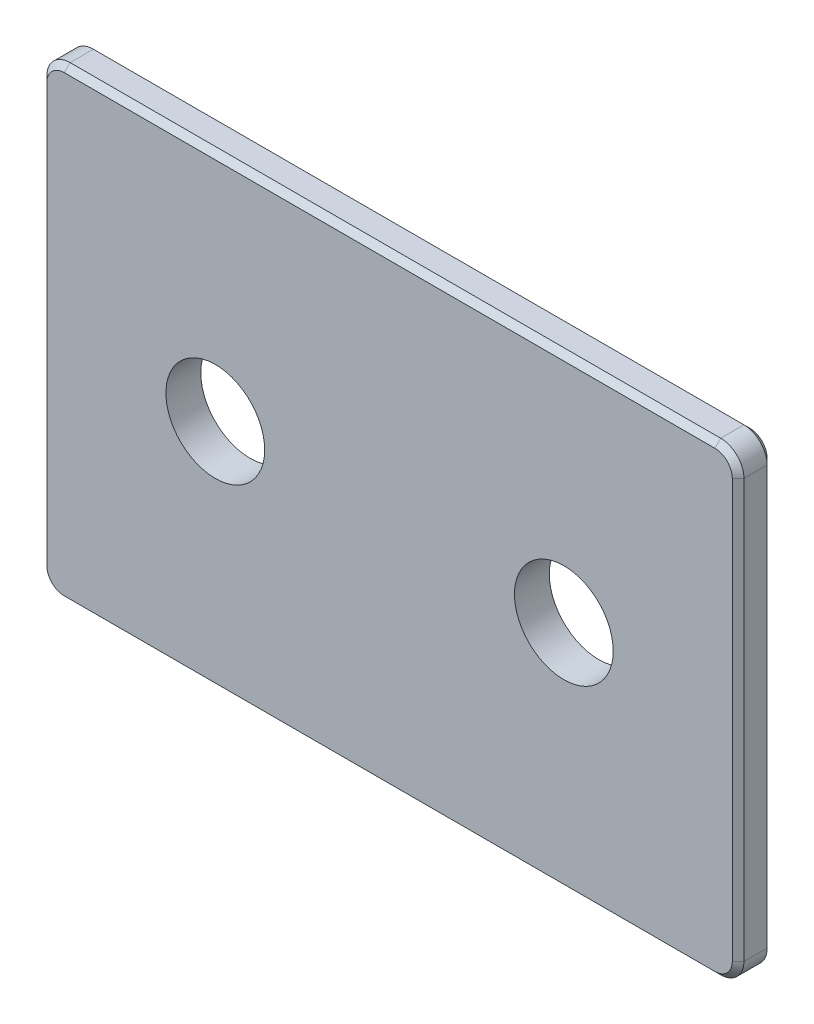
ISO-10303-21;
HEADER;
FILE_DESCRIPTION(('STEP AP214'),'2;1');
FILE_NAME('part.step','',(''),(''),'','','');
FILE_SCHEMA(('AUTOMOTIVE_DESIGN { 1 0 10303 214 1 1 1 1 }'));
ENDSEC;
DATA;
#1=APPLICATION_CONTEXT('core data for automotive mechanical design processes');
#2=APPLICATION_PROTOCOL_DEFINITION('international standard','automotive_design',2000,#1);
#3=PRODUCT_CONTEXT('',#1,'mechanical');
#4=PRODUCT('Part','Part','',(#3));
#5=PRODUCT_RELATED_PRODUCT_CATEGORY('part','',(#4));
#6=PRODUCT_DEFINITION_FORMATION('','',#4);
#7=PRODUCT_DEFINITION_CONTEXT('part definition',#1,'design');
#8=PRODUCT_DEFINITION('design','',#6,#7);
#9=PRODUCT_DEFINITION_SHAPE('','',#8);
#10=(LENGTH_UNIT() NAMED_UNIT(*) SI_UNIT(.MILLI.,.METRE.));
#11=(NAMED_UNIT(*) PLANE_ANGLE_UNIT() SI_UNIT($,.RADIAN.));
#12=(NAMED_UNIT(*) SI_UNIT($,.STERADIAN.) SOLID_ANGLE_UNIT());
#13=UNCERTAINTY_MEASURE_WITH_UNIT(LENGTH_MEASURE(1.E-05),#10,'distance_accuracy_value','');
#14=(GEOMETRIC_REPRESENTATION_CONTEXT(3) GLOBAL_UNCERTAINTY_ASSIGNED_CONTEXT((#13)) GLOBAL_UNIT_ASSIGNED_CONTEXT((#10,
#11,#12)) REPRESENTATION_CONTEXT('',''));
#15=CARTESIAN_POINT('',(0.,0.,0.));
#16=DIRECTION('',(0.,0.,1.));
#17=DIRECTION('',(1.,0.,0.));
#18=AXIS2_PLACEMENT_3D('',#15,#16,#17);
#19=CARTESIAN_POINT('',(0.,0.,3.));
#20=DIRECTION('',(1.,0.,0.));
#21=DIRECTION('',(0.,0.,-1.));
#22=AXIS2_PLACEMENT_3D('',#19,#20,#21);
#23=PLANE('',#22);
#24=DIRECTION('',(0.,0.,-1.));
#25=VECTOR('',#24,1.);
#26=CARTESIAN_POINT('',(0.,38.,3.));
#27=LINE('',#26,#25);
#28=CARTESIAN_POINT('',(0.,38.,2.50000000000001));
#29=VERTEX_POINT('',#28);
#30=CARTESIAN_POINT('',(0.,38.,0.5));
#31=VERTEX_POINT('',#30);
#32=EDGE_CURVE('E285',#29,#31,#27,.T.);
#33=ORIENTED_EDGE('',*,*,#32,.T.);
#34=DIRECTION('',(0.,-1.,0.));
#35=VECTOR('',#34,1.);
#36=CARTESIAN_POINT('',(0.,2.,0.5));
#37=LINE('',#36,#35);
#38=CARTESIAN_POINT('',(0.,2.,0.5));
#39=VERTEX_POINT('',#38);
#40=EDGE_CURVE('E207',#31,#39,#37,.T.);
#41=ORIENTED_EDGE('',*,*,#40,.T.);
#42=DIRECTION('',(0.,0.,-1.));
#43=VECTOR('',#42,1.);
#44=CARTESIAN_POINT('',(0.,2.,3.));
#45=LINE('',#44,#43);
#46=CARTESIAN_POINT('',(0.,2.,2.50000000000001));
#47=VERTEX_POINT('',#46);
#48=EDGE_CURVE('E293',#39,#47,#45,.F.);
#49=ORIENTED_EDGE('',*,*,#48,.T.);
#50=DIRECTION('',(0.,1.,0.));
#51=VECTOR('',#50,1.);
#52=CARTESIAN_POINT('',(0.,0.,2.50000000000001));
#53=LINE('',#52,#51);
#54=EDGE_CURVE('E205',#47,#29,#53,.T.);
#55=ORIENTED_EDGE('',*,*,#54,.T.);
#56=EDGE_LOOP('',(#33,#41,#49,#55));
#57=FACE_BOUND('',#56,.T.);
#58=ADVANCED_FACE('F38',(#57),#23,.F.);
#59=CARTESIAN_POINT('',(0.,0.,3.));
#60=DIRECTION('',(0.,1.,0.));
#61=DIRECTION('',(0.,0.,1.));
#62=AXIS2_PLACEMENT_3D('',#59,#60,#61);
#63=PLANE('',#62);
#64=DIRECTION('',(0.,0.,-1.));
#65=VECTOR('',#64,1.);
#66=CARTESIAN_POINT('',(2.,0.,3.));
#67=LINE('',#66,#65);
#68=CARTESIAN_POINT('',(2.,0.,2.50000000000001));
#69=VERTEX_POINT('',#68);
#70=CARTESIAN_POINT('',(2.,0.,0.5));
#71=VERTEX_POINT('',#70);
#72=EDGE_CURVE('E326',#69,#71,#67,.T.);
#73=ORIENTED_EDGE('',*,*,#72,.T.);
#74=DIRECTION('',(1.,0.,0.));
#75=VECTOR('',#74,1.);
#76=CARTESIAN_POINT('',(58.,0.,0.5));
#77=LINE('',#76,#75);
#78=CARTESIAN_POINT('',(58.,0.,0.5));
#79=VERTEX_POINT('',#78);
#80=EDGE_CURVE('E215',#71,#79,#77,.T.);
#81=ORIENTED_EDGE('',*,*,#80,.T.);
#82=DIRECTION('',(0.,0.,-1.));
#83=VECTOR('',#82,1.);
#84=CARTESIAN_POINT('',(58.,0.,3.));
#85=LINE('',#84,#83);
#86=CARTESIAN_POINT('',(58.,0.,2.50000000000001));
#87=VERTEX_POINT('',#86);
#88=EDGE_CURVE('E323',#79,#87,#85,.F.);
#89=ORIENTED_EDGE('',*,*,#88,.T.);
#90=DIRECTION('',(-1.,0.,0.));
#91=VECTOR('',#90,1.);
#92=CARTESIAN_POINT('',(0.,0.,2.50000000000001));
#93=LINE('',#92,#91);
#94=EDGE_CURVE('E213',#87,#69,#93,.T.);
#95=ORIENTED_EDGE('',*,*,#94,.T.);
#96=EDGE_LOOP('',(#73,#81,#89,#95));
#97=FACE_BOUND('',#96,.T.);
#98=ADVANCED_FACE('F352',(#97),#63,.F.);
#99=CARTESIAN_POINT('',(60.,0.,3.));
#100=DIRECTION('',(-1.,0.,0.));
#101=DIRECTION('',(0.,0.,1.));
#102=AXIS2_PLACEMENT_3D('',#99,#100,#101);
#103=PLANE('',#102);
#104=DIRECTION('',(0.,0.,-1.));
#105=VECTOR('',#104,1.);
#106=CARTESIAN_POINT('',(60.,2.,3.));
#107=LINE('',#106,#105);
#108=CARTESIAN_POINT('',(60.,2.,2.50000000000001));
#109=VERTEX_POINT('',#108);
#110=CARTESIAN_POINT('',(60.,2.,0.5));
#111=VERTEX_POINT('',#110);
#112=EDGE_CURVE('E321',#109,#111,#107,.T.);
#113=ORIENTED_EDGE('',*,*,#112,.T.);
#114=DIRECTION('',(0.,1.,0.));
#115=VECTOR('',#114,1.);
#116=CARTESIAN_POINT('',(60.,38.,0.5));
#117=LINE('',#116,#115);
#118=CARTESIAN_POINT('',(60.,38.,0.5));
#119=VERTEX_POINT('',#118);
#120=EDGE_CURVE('E191',#111,#119,#117,.T.);
#121=ORIENTED_EDGE('',*,*,#120,.T.);
#122=DIRECTION('',(0.,0.,-1.));
#123=VECTOR('',#122,1.);
#124=CARTESIAN_POINT('',(60.,38.,3.));
#125=LINE('',#124,#123);
#126=CARTESIAN_POINT('',(60.,38.,2.50000000000001));
#127=VERTEX_POINT('',#126);
#128=EDGE_CURVE('E327',#119,#127,#125,.F.);
#129=ORIENTED_EDGE('',*,*,#128,.T.);
#130=DIRECTION('',(0.,-1.,0.));
#131=VECTOR('',#130,1.);
#132=CARTESIAN_POINT('',(60.,0.,2.50000000000001));
#133=LINE('',#132,#131);
#134=EDGE_CURVE('E189',#127,#109,#133,.T.);
#135=ORIENTED_EDGE('',*,*,#134,.T.);
#136=EDGE_LOOP('',(#113,#121,#129,#135));
#137=FACE_BOUND('',#136,.T.);
#138=ADVANCED_FACE('F324',(#137),#103,.F.);
#139=CARTESIAN_POINT('',(0.,40.,3.));
#140=DIRECTION('',(0.,-1.,0.));
#141=DIRECTION('',(0.,0.,-1.));
#142=AXIS2_PLACEMENT_3D('',#139,#140,#141);
#143=PLANE('',#142);
#144=DIRECTION('',(0.,0.,-1.));
#145=VECTOR('',#144,1.);
#146=CARTESIAN_POINT('',(58.,40.,3.));
#147=LINE('',#146,#145);
#148=CARTESIAN_POINT('',(58.,40.,2.50000000000001));
#149=VERTEX_POINT('',#148);
#150=CARTESIAN_POINT('',(58.,40.,0.5));
#151=VERTEX_POINT('',#150);
#152=EDGE_CURVE('E291',#149,#151,#147,.T.);
#153=ORIENTED_EDGE('',*,*,#152,.T.);
#154=DIRECTION('',(-1.,0.,0.));
#155=VECTOR('',#154,1.);
#156=CARTESIAN_POINT('',(2.,40.,0.5));
#157=LINE('',#156,#155);
#158=CARTESIAN_POINT('',(2.,40.,0.5));
#159=VERTEX_POINT('',#158);
#160=EDGE_CURVE('E199',#151,#159,#157,.T.);
#161=ORIENTED_EDGE('',*,*,#160,.T.);
#162=DIRECTION('',(0.,0.,-1.));
#163=VECTOR('',#162,1.);
#164=CARTESIAN_POINT('',(2.,40.,3.));
#165=LINE('',#164,#163);
#166=CARTESIAN_POINT('',(2.,40.,2.50000000000001));
#167=VERTEX_POINT('',#166);
#168=EDGE_CURVE('E173',#159,#167,#165,.F.);
#169=ORIENTED_EDGE('',*,*,#168,.T.);
#170=DIRECTION('',(1.,0.,0.));
#171=VECTOR('',#170,1.);
#172=CARTESIAN_POINT('',(0.,40.,2.50000000000001));
#173=LINE('',#172,#171);
#174=EDGE_CURVE('E197',#167,#149,#173,.T.);
#175=ORIENTED_EDGE('',*,*,#174,.T.);
#176=EDGE_LOOP('',(#153,#161,#169,#175));
#177=FACE_BOUND('',#176,.T.);
#178=ADVANCED_FACE('F288',(#177),#143,.F.);
#179=CARTESIAN_POINT('',(0.,0.,3.));
#180=DIRECTION('',(0.,0.,-1.));
#181=DIRECTION('',(-1.,0.,0.));
#182=AXIS2_PLACEMENT_3D('',#179,#180,#181);
#183=PLANE('',#182);
#184=DIRECTION('',(1.,0.,0.));
#185=VECTOR('',#184,1.);
#186=CARTESIAN_POINT('',(0.,0.5,3.));
#187=LINE('',#186,#185);
#188=CARTESIAN_POINT('',(2.,0.5,3.));
#189=VERTEX_POINT('',#188);
#190=CARTESIAN_POINT('',(58.,0.5,3.));
#191=VERTEX_POINT('',#190);
#192=EDGE_CURVE('E217',#189,#191,#187,.T.);
#193=ORIENTED_EDGE('',*,*,#192,.T.);
#194=CARTESIAN_POINT('',(58.,2.,3.));
#195=DIRECTION('',(0.,0.,-1.));
#196=DIRECTION('',(-1.,0.,0.));
#197=AXIS2_PLACEMENT_3D('',#194,#195,#196);
#198=CIRCLE('',#197,1.5);
#199=CARTESIAN_POINT('',(59.5,2.,3.));
#200=VERTEX_POINT('',#199);
#201=EDGE_CURVE('E11',#191,#200,#198,.F.);
#202=ORIENTED_EDGE('',*,*,#201,.T.);
#203=DIRECTION('',(0.,1.,0.));
#204=VECTOR('',#203,1.);
#205=CARTESIAN_POINT('',(59.5,0.,3.));
#206=LINE('',#205,#204);
#207=CARTESIAN_POINT('',(59.5,38.,3.));
#208=VERTEX_POINT('',#207);
#209=EDGE_CURVE('E47',#200,#208,#206,.T.);
#210=ORIENTED_EDGE('',*,*,#209,.T.);
#211=CARTESIAN_POINT('',(58.,38.,3.));
#212=DIRECTION('',(0.,0.,-1.));
#213=DIRECTION('',(-1.,0.,0.));
#214=AXIS2_PLACEMENT_3D('',#211,#212,#213);
#215=CIRCLE('',#214,1.5);
#216=CARTESIAN_POINT('',(58.,39.5,3.));
#217=VERTEX_POINT('',#216);
#218=EDGE_CURVE('E227',#208,#217,#215,.F.);
#219=ORIENTED_EDGE('',*,*,#218,.T.);
#220=DIRECTION('',(-1.,0.,0.));
#221=VECTOR('',#220,1.);
#222=CARTESIAN_POINT('',(0.,39.5,3.));
#223=LINE('',#222,#221);
#224=CARTESIAN_POINT('',(2.,39.5,3.));
#225=VERTEX_POINT('',#224);
#226=EDGE_CURVE('E225',#217,#225,#223,.T.);
#227=ORIENTED_EDGE('',*,*,#226,.T.);
#228=CARTESIAN_POINT('',(2.,38.,3.));
#229=DIRECTION('',(0.,0.,-1.));
#230=DIRECTION('',(-1.,0.,0.));
#231=AXIS2_PLACEMENT_3D('',#228,#229,#230);
#232=CIRCLE('',#231,1.5);
#233=CARTESIAN_POINT('',(0.5,38.,3.));
#234=VERTEX_POINT('',#233);
#235=EDGE_CURVE('E223',#225,#234,#232,.F.);
#236=ORIENTED_EDGE('',*,*,#235,.T.);
#237=DIRECTION('',(0.,-1.,0.));
#238=VECTOR('',#237,1.);
#239=CARTESIAN_POINT('',(0.5,0.,3.));
#240=LINE('',#239,#238);
#241=CARTESIAN_POINT('',(0.5,2.,3.));
#242=VERTEX_POINT('',#241);
#243=EDGE_CURVE('E221',#234,#242,#240,.T.);
#244=ORIENTED_EDGE('',*,*,#243,.T.);
#245=CARTESIAN_POINT('',(2.,2.,3.));
#246=DIRECTION('',(0.,0.,-1.));
#247=DIRECTION('',(-1.,0.,0.));
#248=AXIS2_PLACEMENT_3D('',#245,#246,#247);
#249=CIRCLE('',#248,1.5);
#250=EDGE_CURVE('E219',#242,#189,#249,.F.);
#251=ORIENTED_EDGE('',*,*,#250,.T.);
#252=EDGE_LOOP('',(#193,#202,#210,#219,#227,#236,#244,#251));
#253=FACE_BOUND('',#252,.T.);
#254=CARTESIAN_POINT('',(15.,20.,3.));
#255=DIRECTION('',(0.,0.,1.));
#256=DIRECTION('',(1.,0.,0.));
#257=AXIS2_PLACEMENT_3D('',#254,#255,#256);
#258=CIRCLE('',#257,4.25);
#259=CARTESIAN_POINT('',(19.25,20.,3.));
#260=VERTEX_POINT('',#259);
#261=EDGE_CURVE('E247',#260,#260,#258,.T.);
#262=ORIENTED_EDGE('',*,*,#261,.F.);
#263=EDGE_LOOP('',(#262));
#264=FACE_BOUND('',#263,.T.);
#265=CARTESIAN_POINT('',(45.,20.,3.));
#266=DIRECTION('',(0.,0.,1.));
#267=DIRECTION('',(1.,0.,0.));
#268=AXIS2_PLACEMENT_3D('',#265,#266,#267);
#269=CIRCLE('',#268,4.25);
#270=CARTESIAN_POINT('',(49.25,20.,3.));
#271=VERTEX_POINT('',#270);
#272=EDGE_CURVE('E633',#271,#271,#269,.T.);
#273=ORIENTED_EDGE('',*,*,#272,.F.);
#274=EDGE_LOOP('',(#273));
#275=FACE_BOUND('',#274,.T.);
#276=ADVANCED_FACE('F362',(#253,#264,#275),#183,.F.);
#277=CARTESIAN_POINT('',(0.,0.,0.));
#278=DIRECTION('',(0.,0.,-1.));
#279=DIRECTION('',(-1.,0.,0.));
#280=AXIS2_PLACEMENT_3D('',#277,#278,#279);
#281=PLANE('',#280);
#282=DIRECTION('',(0.,-1.,0.));
#283=VECTOR('',#282,1.);
#284=CARTESIAN_POINT('',(59.5,2.,0.));
#285=LINE('',#284,#283);
#286=CARTESIAN_POINT('',(59.5,38.,0.));
#287=VERTEX_POINT('',#286);
#288=CARTESIAN_POINT('',(59.5,2.,0.));
#289=VERTEX_POINT('',#288);
#290=EDGE_CURVE('E178',#287,#289,#285,.T.);
#291=ORIENTED_EDGE('',*,*,#290,.T.);
#292=CARTESIAN_POINT('',(58.,2.,0.));
#293=DIRECTION('',(0.,0.,-1.));
#294=DIRECTION('',(-1.,0.,0.));
#295=AXIS2_PLACEMENT_3D('',#292,#293,#294);
#296=CIRCLE('',#295,1.50000000000001);
#297=CARTESIAN_POINT('',(58.,0.499999999999994,0.));
#298=VERTEX_POINT('',#297);
#299=EDGE_CURVE('E158',#289,#298,#296,.T.);
#300=ORIENTED_EDGE('',*,*,#299,.T.);
#301=DIRECTION('',(-1.,0.,0.));
#302=VECTOR('',#301,1.);
#303=CARTESIAN_POINT('',(2.,0.499999999999994,0.));
#304=LINE('',#303,#302);
#305=CARTESIAN_POINT('',(2.,0.499999999999994,0.));
#306=VERTEX_POINT('',#305);
#307=EDGE_CURVE('E166',#298,#306,#304,.T.);
#308=ORIENTED_EDGE('',*,*,#307,.T.);
#309=CARTESIAN_POINT('',(2.,2.,0.));
#310=DIRECTION('',(0.,0.,-1.));
#311=DIRECTION('',(-1.,0.,0.));
#312=AXIS2_PLACEMENT_3D('',#309,#310,#311);
#313=CIRCLE('',#312,1.50000000000001);
#314=CARTESIAN_POINT('',(0.499999999999994,2.,0.));
#315=VERTEX_POINT('',#314);
#316=EDGE_CURVE('E172',#306,#315,#313,.T.);
#317=ORIENTED_EDGE('',*,*,#316,.T.);
#318=DIRECTION('',(0.,1.,0.));
#319=VECTOR('',#318,1.);
#320=CARTESIAN_POINT('',(0.499999999999994,38.,0.));
#321=LINE('',#320,#319);
#322=CARTESIAN_POINT('',(0.499999999999994,38.,0.));
#323=VERTEX_POINT('',#322);
#324=EDGE_CURVE('E298',#315,#323,#321,.T.);
#325=ORIENTED_EDGE('',*,*,#324,.T.);
#326=CARTESIAN_POINT('',(2.,38.,0.));
#327=DIRECTION('',(0.,0.,-1.));
#328=DIRECTION('',(-1.,0.,0.));
#329=AXIS2_PLACEMENT_3D('',#326,#327,#328);
#330=CIRCLE('',#329,1.50000000000001);
#331=CARTESIAN_POINT('',(2.,39.5,0.));
#332=VERTEX_POINT('',#331);
#333=EDGE_CURVE('E300',#323,#332,#330,.T.);
#334=ORIENTED_EDGE('',*,*,#333,.T.);
#335=DIRECTION('',(1.,0.,0.));
#336=VECTOR('',#335,1.);
#337=CARTESIAN_POINT('',(58.,39.5,0.));
#338=LINE('',#337,#336);
#339=CARTESIAN_POINT('',(58.,39.5,0.));
#340=VERTEX_POINT('',#339);
#341=EDGE_CURVE('E302',#332,#340,#338,.T.);
#342=ORIENTED_EDGE('',*,*,#341,.T.);
#343=CARTESIAN_POINT('',(58.,38.,0.));
#344=DIRECTION('',(0.,0.,-1.));
#345=DIRECTION('',(-1.,0.,0.));
#346=AXIS2_PLACEMENT_3D('',#343,#344,#345);
#347=CIRCLE('',#346,1.50000000000001);
#348=EDGE_CURVE('E184',#340,#287,#347,.T.);
#349=ORIENTED_EDGE('',*,*,#348,.T.);
#350=EDGE_LOOP('',(#291,#300,#308,#317,#325,#334,#342,#349));
#351=FACE_BOUND('',#350,.T.);
#352=CARTESIAN_POINT('',(15.,20.,0.));
#353=DIRECTION('',(0.,0.,-1.));
#354=DIRECTION('',(-1.,0.,0.));
#355=AXIS2_PLACEMENT_3D('',#352,#353,#354);
#356=CIRCLE('',#355,4.24999999999999);
#357=CARTESIAN_POINT('',(10.75,20.,0.));
#358=VERTEX_POINT('',#357);
#359=EDGE_CURVE('E635',#358,#358,#356,.T.);
#360=ORIENTED_EDGE('',*,*,#359,.F.);
#361=EDGE_LOOP('',(#360));
#362=FACE_BOUND('',#361,.T.);
#363=CARTESIAN_POINT('',(45.,20.,0.));
#364=DIRECTION('',(0.,0.,-1.));
#365=DIRECTION('',(-1.,0.,0.));
#366=AXIS2_PLACEMENT_3D('',#363,#364,#365);
#367=CIRCLE('',#366,4.25);
#368=CARTESIAN_POINT('',(40.75,20.,0.));
#369=VERTEX_POINT('',#368);
#370=EDGE_CURVE('E331',#369,#369,#367,.T.);
#371=ORIENTED_EDGE('',*,*,#370,.F.);
#372=EDGE_LOOP('',(#371));
#373=FACE_BOUND('',#372,.T.);
#374=ADVANCED_FACE('F175',(#351,#362,#373),#281,.T.);
#375=CARTESIAN_POINT('',(45.,20.,3.));
#376=DIRECTION('',(0.,0.,1.));
#377=DIRECTION('',(1.,0.,0.));
#378=AXIS2_PLACEMENT_3D('',#375,#376,#377);
#379=CYLINDRICAL_SURFACE('',#378,4.25);
#380=ORIENTED_EDGE('',*,*,#370,.T.);
#381=EDGE_LOOP('',(#380));
#382=FACE_BOUND('',#381,.T.);
#383=ORIENTED_EDGE('',*,*,#272,.T.);
#384=EDGE_LOOP('',(#383));
#385=FACE_BOUND('',#384,.T.);
#386=ADVANCED_FACE('F551',(#382,#385),#379,.F.);
#387=CARTESIAN_POINT('',(15.,20.,3.));
#388=DIRECTION('',(0.,0.,1.));
#389=DIRECTION('',(1.,0.,0.));
#390=AXIS2_PLACEMENT_3D('',#387,#388,#389);
#391=CYLINDRICAL_SURFACE('',#390,4.24999999999999);
#392=ORIENTED_EDGE('',*,*,#359,.T.);
#393=EDGE_LOOP('',(#392));
#394=FACE_BOUND('',#393,.T.);
#395=ORIENTED_EDGE('',*,*,#261,.T.);
#396=EDGE_LOOP('',(#395));
#397=FACE_BOUND('',#396,.T.);
#398=ADVANCED_FACE('F398',(#394,#397),#391,.F.);
#399=CARTESIAN_POINT('',(58.,2.,3.));
#400=DIRECTION('',(0.,0.,-1.));
#401=DIRECTION('',(-1.,0.,0.));
#402=AXIS2_PLACEMENT_3D('',#399,#400,#401);
#403=CYLINDRICAL_SURFACE('',#402,2.);
#404=ORIENTED_EDGE('',*,*,#88,.F.);
#405=CARTESIAN_POINT('',(58.,2.,0.5));
#406=DIRECTION('',(0.,0.,-1.));
#407=DIRECTION('',(-1.,0.,0.));
#408=AXIS2_PLACEMENT_3D('',#405,#406,#407);
#409=CIRCLE('',#408,2.);
#410=EDGE_CURVE('E160',#79,#111,#409,.F.);
#411=ORIENTED_EDGE('',*,*,#410,.T.);
#412=ORIENTED_EDGE('',*,*,#112,.F.);
#413=CARTESIAN_POINT('',(58.,2.,2.50000000000001));
#414=DIRECTION('',(0.,0.,-1.));
#415=DIRECTION('',(-1.,0.,0.));
#416=AXIS2_PLACEMENT_3D('',#413,#414,#415);
#417=CIRCLE('',#416,2.);
#418=EDGE_CURVE('E180',#109,#87,#417,.T.);
#419=ORIENTED_EDGE('',*,*,#418,.T.);
#420=EDGE_LOOP('',(#404,#411,#412,#419));
#421=FACE_BOUND('',#420,.T.);
#422=ADVANCED_FACE('F320',(#421),#403,.T.);
#423=CARTESIAN_POINT('',(2.,2.,3.));
#424=DIRECTION('',(0.,0.,-1.));
#425=DIRECTION('',(-1.,0.,0.));
#426=AXIS2_PLACEMENT_3D('',#423,#424,#425);
#427=CYLINDRICAL_SURFACE('',#426,2.);
#428=ORIENTED_EDGE('',*,*,#48,.F.);
#429=CARTESIAN_POINT('',(2.,2.,0.5));
#430=DIRECTION('',(0.,0.,-1.));
#431=DIRECTION('',(-1.,0.,0.));
#432=AXIS2_PLACEMENT_3D('',#429,#430,#431);
#433=CIRCLE('',#432,2.);
#434=EDGE_CURVE('E211',#39,#71,#433,.F.);
#435=ORIENTED_EDGE('',*,*,#434,.T.);
#436=ORIENTED_EDGE('',*,*,#72,.F.);
#437=CARTESIAN_POINT('',(2.,2.,2.50000000000001));
#438=DIRECTION('',(0.,0.,-1.));
#439=DIRECTION('',(-1.,0.,0.));
#440=AXIS2_PLACEMENT_3D('',#437,#438,#439);
#441=CIRCLE('',#440,2.);
#442=EDGE_CURVE('E209',#69,#47,#441,.T.);
#443=ORIENTED_EDGE('',*,*,#442,.T.);
#444=EDGE_LOOP('',(#428,#435,#436,#443));
#445=FACE_BOUND('',#444,.T.);
#446=ADVANCED_FACE('F342',(#445),#427,.T.);
#447=CARTESIAN_POINT('',(2.,38.,3.));
#448=DIRECTION('',(0.,0.,-1.));
#449=DIRECTION('',(-1.,0.,0.));
#450=AXIS2_PLACEMENT_3D('',#447,#448,#449);
#451=CYLINDRICAL_SURFACE('',#450,2.);
#452=ORIENTED_EDGE('',*,*,#168,.F.);
#453=CARTESIAN_POINT('',(2.,38.,0.5));
#454=DIRECTION('',(0.,0.,-1.));
#455=DIRECTION('',(-1.,0.,0.));
#456=AXIS2_PLACEMENT_3D('',#453,#454,#455);
#457=CIRCLE('',#456,2.);
#458=EDGE_CURVE('E203',#159,#31,#457,.F.);
#459=ORIENTED_EDGE('',*,*,#458,.T.);
#460=ORIENTED_EDGE('',*,*,#32,.F.);
#461=CARTESIAN_POINT('',(2.,38.,2.50000000000001));
#462=DIRECTION('',(0.,0.,-1.));
#463=DIRECTION('',(-1.,0.,0.));
#464=AXIS2_PLACEMENT_3D('',#461,#462,#463);
#465=CIRCLE('',#464,2.);
#466=EDGE_CURVE('E201',#29,#167,#465,.T.);
#467=ORIENTED_EDGE('',*,*,#466,.T.);
#468=EDGE_LOOP('',(#452,#459,#460,#467));
#469=FACE_BOUND('',#468,.T.);
#470=ADVANCED_FACE('F282',(#469),#451,.T.);
#471=CARTESIAN_POINT('',(58.,38.,3.));
#472=DIRECTION('',(0.,0.,-1.));
#473=DIRECTION('',(-1.,0.,0.));
#474=AXIS2_PLACEMENT_3D('',#471,#472,#473);
#475=CYLINDRICAL_SURFACE('',#474,2.);
#476=ORIENTED_EDGE('',*,*,#128,.F.);
#477=CARTESIAN_POINT('',(58.,38.,0.5));
#478=DIRECTION('',(0.,0.,-1.));
#479=DIRECTION('',(-1.,0.,0.));
#480=AXIS2_PLACEMENT_3D('',#477,#478,#479);
#481=CIRCLE('',#480,2.);
#482=EDGE_CURVE('E195',#119,#151,#481,.F.);
#483=ORIENTED_EDGE('',*,*,#482,.T.);
#484=ORIENTED_EDGE('',*,*,#152,.F.);
#485=CARTESIAN_POINT('',(58.,38.,2.50000000000001));
#486=DIRECTION('',(0.,0.,-1.));
#487=DIRECTION('',(-1.,0.,0.));
#488=AXIS2_PLACEMENT_3D('',#485,#486,#487);
#489=CIRCLE('',#488,2.);
#490=EDGE_CURVE('E193',#149,#127,#489,.T.);
#491=ORIENTED_EDGE('',*,*,#490,.T.);
#492=EDGE_LOOP('',(#476,#483,#484,#491));
#493=FACE_BOUND('',#492,.T.);
#494=ADVANCED_FACE('F371',(#493),#475,.T.);
#495=CARTESIAN_POINT('',(2.,38.,0.));
#496=DIRECTION('',(0.,0.,1.));
#497=DIRECTION('',(1.,0.,0.));
#498=AXIS2_PLACEMENT_3D('',#495,#496,#497);
#499=CONICAL_SURFACE('',#498,1.50000000000001,0.785398163397441);
#500=DIRECTION('',(0.707106781186541,0.,-0.707106781186554));
#501=VECTOR('',#500,1.);
#502=CARTESIAN_POINT('',(0.,38.,0.5));
#503=LINE('',#502,#501);
#504=EDGE_CURVE('E241',#31,#323,#503,.T.);
#505=ORIENTED_EDGE('',*,*,#504,.F.);
#506=ORIENTED_EDGE('',*,*,#458,.F.);
#507=DIRECTION('',(0.,0.707106781186543,0.707106781186552));
#508=VECTOR('',#507,1.);
#509=CARTESIAN_POINT('',(2.,39.5,0.));
#510=LINE('',#509,#508);
#511=EDGE_CURVE('E244',#332,#159,#510,.T.);
#512=ORIENTED_EDGE('',*,*,#511,.F.);
#513=ORIENTED_EDGE('',*,*,#333,.F.);
#514=EDGE_LOOP('',(#505,#506,#512,#513));
#515=FACE_BOUND('',#514,.T.);
#516=ADVANCED_FACE('F378',(#515),#499,.T.);
#517=CARTESIAN_POINT('',(0.,40.,0.5));
#518=DIRECTION('',(0.,0.707106781186552,-0.707106781186543));
#519=DIRECTION('',(1.,0.,0.));
#520=AXIS2_PLACEMENT_3D('',#517,#518,#519);
#521=PLANE('',#520);
#522=ORIENTED_EDGE('',*,*,#511,.T.);
#523=ORIENTED_EDGE('',*,*,#160,.F.);
#524=DIRECTION('',(0.,0.707106781186543,0.707106781186552));
#525=VECTOR('',#524,1.);
#526=CARTESIAN_POINT('',(58.,39.5,0.));
#527=LINE('',#526,#525);
#528=EDGE_CURVE('E238',#340,#151,#527,.T.);
#529=ORIENTED_EDGE('',*,*,#528,.F.);
#530=ORIENTED_EDGE('',*,*,#341,.F.);
#531=EDGE_LOOP('',(#522,#523,#529,#530));
#532=FACE_BOUND('',#531,.T.);
#533=ADVANCED_FACE('F373',(#532),#521,.T.);
#534=CARTESIAN_POINT('',(0.,0.,0.5));
#535=DIRECTION('',(-0.707106781186552,0.,-0.707106781186543));
#536=DIRECTION('',(0.,1.,0.));
#537=AXIS2_PLACEMENT_3D('',#534,#535,#536);
#538=PLANE('',#537);
#539=ORIENTED_EDGE('',*,*,#504,.T.);
#540=ORIENTED_EDGE('',*,*,#324,.F.);
#541=DIRECTION('',(0.707106781186543,0.,-0.707106781186552));
#542=VECTOR('',#541,1.);
#543=CARTESIAN_POINT('',(0.,2.,0.5));
#544=LINE('',#543,#542);
#545=EDGE_CURVE('E235',#39,#315,#544,.T.);
#546=ORIENTED_EDGE('',*,*,#545,.F.);
#547=ORIENTED_EDGE('',*,*,#40,.F.);
#548=EDGE_LOOP('',(#539,#540,#546,#547));
#549=FACE_BOUND('',#548,.T.);
#550=ADVANCED_FACE('F348',(#549),#538,.T.);
#551=CARTESIAN_POINT('',(58.,38.,0.));
#552=DIRECTION('',(0.,0.,1.));
#553=DIRECTION('',(1.,0.,0.));
#554=AXIS2_PLACEMENT_3D('',#551,#552,#553);
#555=CONICAL_SURFACE('',#554,1.50000000000001,0.78539816339744);
#556=ORIENTED_EDGE('',*,*,#528,.T.);
#557=ORIENTED_EDGE('',*,*,#482,.F.);
#558=DIRECTION('',(0.707106781186543,0.,0.707106781186552));
#559=VECTOR('',#558,1.);
#560=CARTESIAN_POINT('',(59.5,38.,0.));
#561=LINE('',#560,#559);
#562=EDGE_CURVE('E232',#287,#119,#561,.T.);
#563=ORIENTED_EDGE('',*,*,#562,.F.);
#564=ORIENTED_EDGE('',*,*,#348,.F.);
#565=EDGE_LOOP('',(#556,#557,#563,#564));
#566=FACE_BOUND('',#565,.T.);
#567=ADVANCED_FACE('F309',(#566),#555,.T.);
#568=CARTESIAN_POINT('',(2.,2.,0.));
#569=DIRECTION('',(0.,0.,1.));
#570=DIRECTION('',(1.,0.,0.));
#571=AXIS2_PLACEMENT_3D('',#568,#569,#570);
#572=CONICAL_SURFACE('',#571,1.50000000000001,0.785398163397441);
#573=ORIENTED_EDGE('',*,*,#545,.T.);
#574=ORIENTED_EDGE('',*,*,#316,.F.);
#575=DIRECTION('',(0.,0.707106781186543,-0.707106781186552));
#576=VECTOR('',#575,1.);
#577=CARTESIAN_POINT('',(2.,0.,0.5));
#578=LINE('',#577,#576);
#579=EDGE_CURVE('E169',#71,#306,#578,.T.);
#580=ORIENTED_EDGE('',*,*,#579,.F.);
#581=ORIENTED_EDGE('',*,*,#434,.F.);
#582=EDGE_LOOP('',(#573,#574,#580,#581));
#583=FACE_BOUND('',#582,.T.);
#584=ADVANCED_FACE('F350',(#583),#572,.T.);
#585=CARTESIAN_POINT('',(60.,0.,0.5));
#586=DIRECTION('',(0.707106781186552,0.,-0.707106781186543));
#587=DIRECTION('',(0.,-1.,0.));
#588=AXIS2_PLACEMENT_3D('',#585,#586,#587);
#589=PLANE('',#588);
#590=ORIENTED_EDGE('',*,*,#562,.T.);
#591=ORIENTED_EDGE('',*,*,#120,.F.);
#592=DIRECTION('',(0.707106781186543,0.,0.707106781186552));
#593=VECTOR('',#592,1.);
#594=CARTESIAN_POINT('',(59.5,2.,0.));
#595=LINE('',#594,#593);
#596=EDGE_CURVE('E163',#289,#111,#595,.T.);
#597=ORIENTED_EDGE('',*,*,#596,.F.);
#598=ORIENTED_EDGE('',*,*,#290,.F.);
#599=EDGE_LOOP('',(#590,#591,#597,#598));
#600=FACE_BOUND('',#599,.T.);
#601=ADVANCED_FACE('F312',(#600),#589,.T.);
#602=CARTESIAN_POINT('',(0.,0.,0.5));
#603=DIRECTION('',(0.,-0.707106781186552,-0.707106781186543));
#604=DIRECTION('',(-1.,0.,0.));
#605=AXIS2_PLACEMENT_3D('',#602,#603,#604);
#606=PLANE('',#605);
#607=ORIENTED_EDGE('',*,*,#579,.T.);
#608=ORIENTED_EDGE('',*,*,#307,.F.);
#609=DIRECTION('',(0.,0.707106781186543,-0.707106781186552));
#610=VECTOR('',#609,1.);
#611=CARTESIAN_POINT('',(58.,0.,0.5));
#612=LINE('',#611,#610);
#613=EDGE_CURVE('E154',#79,#298,#612,.T.);
#614=ORIENTED_EDGE('',*,*,#613,.F.);
#615=ORIENTED_EDGE('',*,*,#80,.F.);
#616=EDGE_LOOP('',(#607,#608,#614,#615));
#617=FACE_BOUND('',#616,.T.);
#618=ADVANCED_FACE('F167',(#617),#606,.T.);
#619=CARTESIAN_POINT('',(58.,2.,0.));
#620=DIRECTION('',(0.,0.,1.));
#621=DIRECTION('',(1.,0.,0.));
#622=AXIS2_PLACEMENT_3D('',#619,#620,#621);
#623=CONICAL_SURFACE('',#622,1.50000000000001,0.78539816339744);
#624=ORIENTED_EDGE('',*,*,#596,.T.);
#625=ORIENTED_EDGE('',*,*,#410,.F.);
#626=ORIENTED_EDGE('',*,*,#613,.T.);
#627=ORIENTED_EDGE('',*,*,#299,.F.);
#628=EDGE_LOOP('',(#624,#625,#626,#627));
#629=FACE_BOUND('',#628,.T.);
#630=ADVANCED_FACE('F156',(#629),#623,.T.);
#631=CARTESIAN_POINT('',(2.,38.,3.));
#632=DIRECTION('',(0.,0.,-1.));
#633=DIRECTION('',(-1.,0.,0.));
#634=AXIS2_PLACEMENT_3D('',#631,#632,#633);
#635=CONICAL_SURFACE('',#634,1.5,0.785398163397455);
#636=DIRECTION('',(0.,-0.707106781186552,0.707106781186543));
#637=VECTOR('',#636,1.);
#638=CARTESIAN_POINT('',(2.,40.,2.50000000000001));
#639=LINE('',#638,#637);
#640=EDGE_CURVE('E262',#167,#225,#639,.T.);
#641=ORIENTED_EDGE('',*,*,#640,.F.);
#642=ORIENTED_EDGE('',*,*,#466,.F.);
#643=DIRECTION('',(-0.707106781186552,0.,-0.707106781186543));
#644=VECTOR('',#643,1.);
#645=CARTESIAN_POINT('',(0.5,38.,3.));
#646=LINE('',#645,#644);
#647=EDGE_CURVE('E42',#234,#29,#646,.T.);
#648=ORIENTED_EDGE('',*,*,#647,.F.);
#649=ORIENTED_EDGE('',*,*,#235,.F.);
#650=EDGE_LOOP('',(#641,#642,#648,#649));
#651=FACE_BOUND('',#650,.T.);
#652=ADVANCED_FACE('F40',(#651),#635,.T.);
#653=CARTESIAN_POINT('',(0.5,0.,3.));
#654=DIRECTION('',(0.707106781186543,0.,-0.707106781186552));
#655=DIRECTION('',(0.,-1.,0.));
#656=AXIS2_PLACEMENT_3D('',#653,#654,#655);
#657=PLANE('',#656);
#658=ORIENTED_EDGE('',*,*,#647,.T.);
#659=ORIENTED_EDGE('',*,*,#54,.F.);
#660=DIRECTION('',(-0.707106781186552,0.,-0.707106781186543));
#661=VECTOR('',#660,1.);
#662=CARTESIAN_POINT('',(0.5,2.,3.));
#663=LINE('',#662,#661);
#664=EDGE_CURVE('E260',#242,#47,#663,.T.);
#665=ORIENTED_EDGE('',*,*,#664,.F.);
#666=ORIENTED_EDGE('',*,*,#243,.F.);
#667=EDGE_LOOP('',(#658,#659,#665,#666));
#668=FACE_BOUND('',#667,.T.);
#669=ADVANCED_FACE('F273',(#668),#657,.F.);
#670=CARTESIAN_POINT('',(0.,39.5,3.));
#671=DIRECTION('',(0.,-0.707106781186543,-0.707106781186552));
#672=DIRECTION('',(-1.,0.,0.));
#673=AXIS2_PLACEMENT_3D('',#670,#671,#672);
#674=PLANE('',#673);
#675=ORIENTED_EDGE('',*,*,#640,.T.);
#676=ORIENTED_EDGE('',*,*,#226,.F.);
#677=DIRECTION('',(0.,-0.707106781186552,0.707106781186543));
#678=VECTOR('',#677,1.);
#679=CARTESIAN_POINT('',(58.,40.,2.50000000000001));
#680=LINE('',#679,#678);
#681=EDGE_CURVE('E257',#149,#217,#680,.T.);
#682=ORIENTED_EDGE('',*,*,#681,.F.);
#683=ORIENTED_EDGE('',*,*,#174,.F.);
#684=EDGE_LOOP('',(#675,#676,#682,#683));
#685=FACE_BOUND('',#684,.T.);
#686=ADVANCED_FACE('F365',(#685),#674,.F.);
#687=CARTESIAN_POINT('',(2.,2.,3.));
#688=DIRECTION('',(0.,0.,-1.));
#689=DIRECTION('',(-1.,0.,0.));
#690=AXIS2_PLACEMENT_3D('',#687,#688,#689);
#691=CONICAL_SURFACE('',#690,1.5,0.785398163397455);
#692=ORIENTED_EDGE('',*,*,#664,.T.);
#693=ORIENTED_EDGE('',*,*,#442,.F.);
#694=DIRECTION('',(0.,-0.707106781186552,-0.707106781186543));
#695=VECTOR('',#694,1.);
#696=CARTESIAN_POINT('',(2.,0.5,3.));
#697=LINE('',#696,#695);
#698=EDGE_CURVE('E254',#189,#69,#697,.T.);
#699=ORIENTED_EDGE('',*,*,#698,.F.);
#700=ORIENTED_EDGE('',*,*,#250,.F.);
#701=EDGE_LOOP('',(#692,#693,#699,#700));
#702=FACE_BOUND('',#701,.T.);
#703=ADVANCED_FACE('F356',(#702),#691,.T.);
#704=CARTESIAN_POINT('',(58.,38.,3.));
#705=DIRECTION('',(0.,0.,-1.));
#706=DIRECTION('',(-1.,0.,0.));
#707=AXIS2_PLACEMENT_3D('',#704,#705,#706);
#708=CONICAL_SURFACE('',#707,1.5,0.785398163397453);
#709=ORIENTED_EDGE('',*,*,#681,.T.);
#710=ORIENTED_EDGE('',*,*,#218,.F.);
#711=DIRECTION('',(-0.707106781186552,0.,0.707106781186543));
#712=VECTOR('',#711,1.);
#713=CARTESIAN_POINT('',(60.,38.,2.50000000000001));
#714=LINE('',#713,#712);
#715=EDGE_CURVE('E251',#127,#208,#714,.T.);
#716=ORIENTED_EDGE('',*,*,#715,.F.);
#717=ORIENTED_EDGE('',*,*,#490,.F.);
#718=EDGE_LOOP('',(#709,#710,#716,#717));
#719=FACE_BOUND('',#718,.T.);
#720=ADVANCED_FACE('F368',(#719),#708,.T.);
#721=CARTESIAN_POINT('',(0.,0.5,3.));
#722=DIRECTION('',(0.,0.707106781186543,-0.707106781186552));
#723=DIRECTION('',(1.,0.,0.));
#724=AXIS2_PLACEMENT_3D('',#721,#722,#723);
#725=PLANE('',#724);
#726=ORIENTED_EDGE('',*,*,#698,.T.);
#727=ORIENTED_EDGE('',*,*,#94,.F.);
#728=DIRECTION('',(0.,-0.707106781186552,-0.707106781186543));
#729=VECTOR('',#728,1.);
#730=CARTESIAN_POINT('',(58.,0.5,3.));
#731=LINE('',#730,#729);
#732=EDGE_CURVE('E249',#191,#87,#731,.T.);
#733=ORIENTED_EDGE('',*,*,#732,.F.);
#734=ORIENTED_EDGE('',*,*,#192,.F.);
#735=EDGE_LOOP('',(#726,#727,#733,#734));
#736=FACE_BOUND('',#735,.T.);
#737=ADVANCED_FACE('F360',(#736),#725,.F.);
#738=CARTESIAN_POINT('',(59.5,0.,3.));
#739=DIRECTION('',(-0.707106781186543,0.,-0.707106781186552));
#740=DIRECTION('',(0.,1.,0.));
#741=AXIS2_PLACEMENT_3D('',#738,#739,#740);
#742=PLANE('',#741);
#743=ORIENTED_EDGE('',*,*,#715,.T.);
#744=ORIENTED_EDGE('',*,*,#209,.F.);
#745=DIRECTION('',(-0.707106781186552,0.,0.707106781186543));
#746=VECTOR('',#745,1.);
#747=CARTESIAN_POINT('',(60.,2.,2.50000000000001));
#748=LINE('',#747,#746);
#749=EDGE_CURVE('E55',#109,#200,#748,.T.);
#750=ORIENTED_EDGE('',*,*,#749,.F.);
#751=ORIENTED_EDGE('',*,*,#134,.F.);
#752=EDGE_LOOP('',(#743,#744,#750,#751));
#753=FACE_BOUND('',#752,.T.);
#754=ADVANCED_FACE('F472',(#753),#742,.F.);
#755=CARTESIAN_POINT('',(58.,2.,3.));
#756=DIRECTION('',(0.,0.,-1.));
#757=DIRECTION('',(-1.,0.,0.));
#758=AXIS2_PLACEMENT_3D('',#755,#756,#757);
#759=CONICAL_SURFACE('',#758,1.5,0.785398163397453);
#760=ORIENTED_EDGE('',*,*,#732,.T.);
#761=ORIENTED_EDGE('',*,*,#418,.F.);
#762=ORIENTED_EDGE('',*,*,#749,.T.);
#763=ORIENTED_EDGE('',*,*,#201,.F.);
#764=EDGE_LOOP('',(#760,#761,#762,#763));
#765=FACE_BOUND('',#764,.T.);
#766=ADVANCED_FACE('F479',(#765),#759,.T.);
#767=CLOSED_SHELL('',(#58,#98,#138,#178,#276,#374,#386,#398,#422,#446,#470,#494,#516,#533,#550,
#567,#584,#601,#618,#630,#652,#669,#686,#703,#720,#737,#754,#766));
#768=MANIFOLD_SOLID_BREP('B2',#767);
#769=ADVANCED_BREP_SHAPE_REPRESENTATION('',(#18,#768),#14);
#770=SHAPE_DEFINITION_REPRESENTATION(#9,#769);
ENDSEC;
END-ISO-10303-21;
